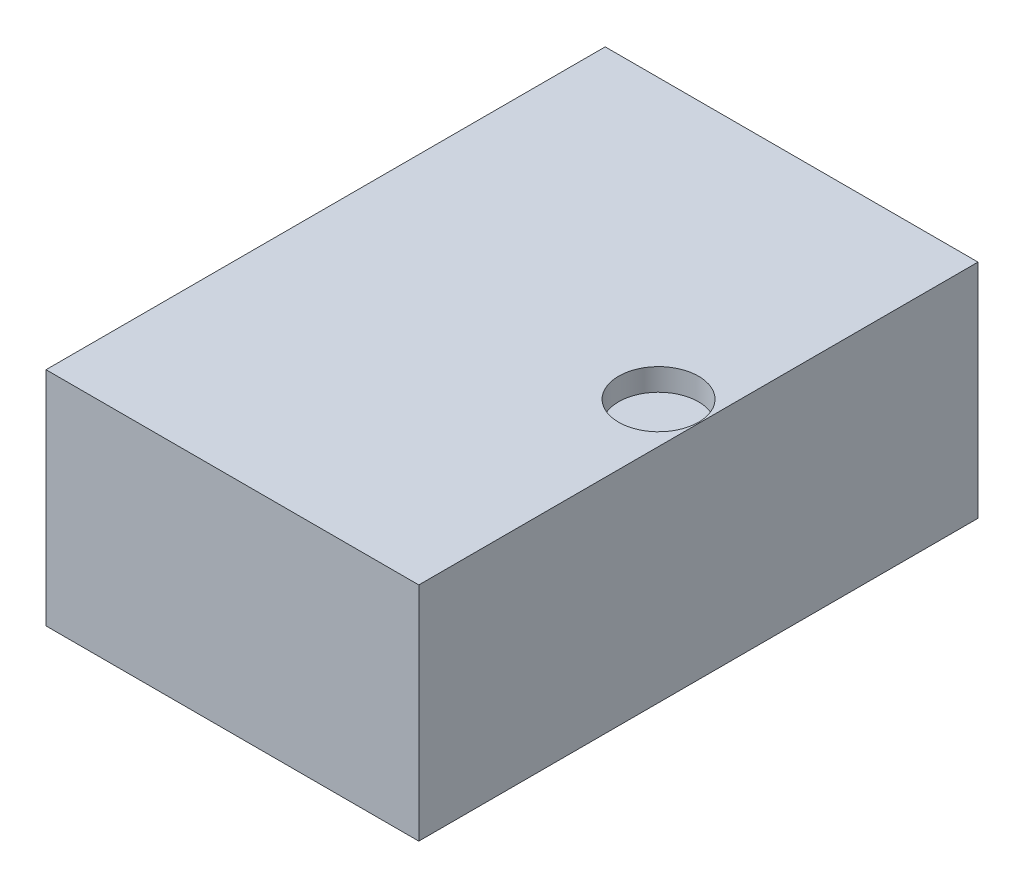
ISO-10303-21;
HEADER;
FILE_DESCRIPTION(('STEP AP214'),'2;1');
FILE_NAME('part.step','',(''),(''),'','','');
FILE_SCHEMA(('AUTOMOTIVE_DESIGN { 1 0 10303 214 1 1 1 1 }'));
ENDSEC;
DATA;
#1=APPLICATION_CONTEXT('core data for automotive mechanical design processes');
#2=APPLICATION_PROTOCOL_DEFINITION('international standard','automotive_design',2000,#1);
#3=PRODUCT_CONTEXT('',#1,'mechanical');
#4=PRODUCT('Part','Part','',(#3));
#5=PRODUCT_RELATED_PRODUCT_CATEGORY('part','',(#4));
#6=PRODUCT_DEFINITION_FORMATION('','',#4);
#7=PRODUCT_DEFINITION_CONTEXT('part definition',#1,'design');
#8=PRODUCT_DEFINITION('design','',#6,#7);
#9=PRODUCT_DEFINITION_SHAPE('','',#8);
#10=(LENGTH_UNIT() NAMED_UNIT(*) SI_UNIT(.MILLI.,.METRE.));
#11=(NAMED_UNIT(*) PLANE_ANGLE_UNIT() SI_UNIT($,.RADIAN.));
#12=(NAMED_UNIT(*) SI_UNIT($,.STERADIAN.) SOLID_ANGLE_UNIT());
#13=UNCERTAINTY_MEASURE_WITH_UNIT(LENGTH_MEASURE(1.E-05),#10,'distance_accuracy_value','');
#14=(GEOMETRIC_REPRESENTATION_CONTEXT(3) GLOBAL_UNCERTAINTY_ASSIGNED_CONTEXT((#13)) GLOBAL_UNIT_ASSIGNED_CONTEXT((#10,
#11,#12)) REPRESENTATION_CONTEXT('',''));
#15=CARTESIAN_POINT('',(0.,0.,0.));
#16=DIRECTION('',(0.,0.,1.));
#17=DIRECTION('',(1.,0.,0.));
#18=AXIS2_PLACEMENT_3D('',#15,#16,#17);
#19=CARTESIAN_POINT('',(0.,0.635,0.));
#20=DIRECTION('',(1.,0.,0.));
#21=DIRECTION('',(0.,0.,-1.));
#22=AXIS2_PLACEMENT_3D('',#19,#20,#21);
#23=PLANE('',#22);
#24=DIRECTION('',(0.,0.,1.));
#25=VECTOR('',#24,1.);
#26=CARTESIAN_POINT('',(0.,0.,0.));
#27=LINE('',#26,#25);
#28=CARTESIAN_POINT('',(0.,0.,-1.6002));
#29=VERTEX_POINT('',#28);
#30=CARTESIAN_POINT('',(0.,0.,0.));
#31=VERTEX_POINT('',#30);
#32=EDGE_CURVE('E95',#29,#31,#27,.T.);
#33=ORIENTED_EDGE('',*,*,#32,.T.);
#34=DIRECTION('',(0.,-1.,0.));
#35=VECTOR('',#34,1.);
#36=CARTESIAN_POINT('',(0.,0.635,0.));
#37=LINE('',#36,#35);
#38=CARTESIAN_POINT('',(0.,0.635,0.));
#39=VERTEX_POINT('',#38);
#40=EDGE_CURVE('E11',#39,#31,#37,.T.);
#41=ORIENTED_EDGE('',*,*,#40,.F.);
#42=DIRECTION('',(0.,0.,1.));
#43=VECTOR('',#42,1.);
#44=CARTESIAN_POINT('',(0.,0.635,0.));
#45=LINE('',#44,#43);
#46=CARTESIAN_POINT('',(0.,0.635,-1.6002));
#47=VERTEX_POINT('',#46);
#48=EDGE_CURVE('E83',#47,#39,#45,.T.);
#49=ORIENTED_EDGE('',*,*,#48,.F.);
#50=DIRECTION('',(0.,-1.,0.));
#51=VECTOR('',#50,1.);
#52=CARTESIAN_POINT('',(0.,0.635,-1.6002));
#53=LINE('',#52,#51);
#54=EDGE_CURVE('E91',#47,#29,#53,.T.);
#55=ORIENTED_EDGE('',*,*,#54,.T.);
#56=EDGE_LOOP('',(#33,#41,#49,#55));
#57=FACE_BOUND('',#56,.T.);
#58=ADVANCED_FACE('F32',(#57),#23,.F.);
#59=CARTESIAN_POINT('',(0.,0.635,0.));
#60=DIRECTION('',(0.,0.,-1.));
#61=DIRECTION('',(-1.,0.,0.));
#62=AXIS2_PLACEMENT_3D('',#59,#60,#61);
#63=PLANE('',#62);
#64=DIRECTION('',(1.,0.,0.));
#65=VECTOR('',#64,1.);
#66=CARTESIAN_POINT('',(0.,0.,0.));
#67=LINE('',#66,#65);
#68=CARTESIAN_POINT('',(1.0668,0.,0.));
#69=VERTEX_POINT('',#68);
#70=EDGE_CURVE('E87',#31,#69,#67,.T.);
#71=ORIENTED_EDGE('',*,*,#70,.T.);
#72=DIRECTION('',(0.,-1.,0.));
#73=VECTOR('',#72,1.);
#74=CARTESIAN_POINT('',(1.0668,0.635,0.));
#75=LINE('',#74,#73);
#76=CARTESIAN_POINT('',(1.0668,0.635,0.));
#77=VERTEX_POINT('',#76);
#78=EDGE_CURVE('E40',#77,#69,#75,.T.);
#79=ORIENTED_EDGE('',*,*,#78,.F.);
#80=DIRECTION('',(1.,0.,0.));
#81=VECTOR('',#80,1.);
#82=CARTESIAN_POINT('',(0.,0.635,0.));
#83=LINE('',#82,#81);
#84=EDGE_CURVE('E78',#39,#77,#83,.T.);
#85=ORIENTED_EDGE('',*,*,#84,.F.);
#86=ORIENTED_EDGE('',*,*,#40,.T.);
#87=EDGE_LOOP('',(#71,#79,#85,#86));
#88=FACE_BOUND('',#87,.T.);
#89=ADVANCED_FACE('F86',(#88),#63,.F.);
#90=CARTESIAN_POINT('',(1.0668,0.635,0.));
#91=DIRECTION('',(-1.,0.,0.));
#92=DIRECTION('',(0.,0.,1.));
#93=AXIS2_PLACEMENT_3D('',#90,#91,#92);
#94=PLANE('',#93);
#95=DIRECTION('',(0.,0.,-1.));
#96=VECTOR('',#95,1.);
#97=CARTESIAN_POINT('',(1.0668,0.,0.));
#98=LINE('',#97,#96);
#99=CARTESIAN_POINT('',(1.0668,0.,-1.6002));
#100=VERTEX_POINT('',#99);
#101=EDGE_CURVE('E65',#69,#100,#98,.T.);
#102=ORIENTED_EDGE('',*,*,#101,.T.);
#103=DIRECTION('',(0.,-1.,0.));
#104=VECTOR('',#103,1.);
#105=CARTESIAN_POINT('',(1.0668,0.635,-1.6002));
#106=LINE('',#105,#104);
#107=CARTESIAN_POINT('',(1.0668,0.635,-1.6002));
#108=VERTEX_POINT('',#107);
#109=EDGE_CURVE('E88',#108,#100,#106,.T.);
#110=ORIENTED_EDGE('',*,*,#109,.F.);
#111=DIRECTION('',(0.,0.,-1.));
#112=VECTOR('',#111,1.);
#113=CARTESIAN_POINT('',(1.0668,0.635,0.));
#114=LINE('',#113,#112);
#115=EDGE_CURVE('E81',#77,#108,#114,.T.);
#116=ORIENTED_EDGE('',*,*,#115,.F.);
#117=ORIENTED_EDGE('',*,*,#78,.T.);
#118=EDGE_LOOP('',(#102,#110,#116,#117));
#119=FACE_BOUND('',#118,.T.);
#120=ADVANCED_FACE('F89',(#119),#94,.F.);
#121=CARTESIAN_POINT('',(0.,0.635,-1.6002));
#122=DIRECTION('',(0.,0.,1.));
#123=DIRECTION('',(1.,0.,0.));
#124=AXIS2_PLACEMENT_3D('',#121,#122,#123);
#125=PLANE('',#124);
#126=DIRECTION('',(-1.,0.,0.));
#127=VECTOR('',#126,1.);
#128=CARTESIAN_POINT('',(0.,0.,-1.6002));
#129=LINE('',#128,#127);
#130=EDGE_CURVE('E71',#100,#29,#129,.T.);
#131=ORIENTED_EDGE('',*,*,#130,.T.);
#132=ORIENTED_EDGE('',*,*,#54,.F.);
#133=DIRECTION('',(-1.,0.,0.));
#134=VECTOR('',#133,1.);
#135=CARTESIAN_POINT('',(0.,0.635,-1.6002));
#136=LINE('',#135,#134);
#137=EDGE_CURVE('E48',#108,#47,#136,.T.);
#138=ORIENTED_EDGE('',*,*,#137,.F.);
#139=ORIENTED_EDGE('',*,*,#109,.T.);
#140=EDGE_LOOP('',(#131,#132,#138,#139));
#141=FACE_BOUND('',#140,.T.);
#142=ADVANCED_FACE('F103',(#141),#125,.F.);
#143=CARTESIAN_POINT('',(0.,0.635,-1.6002));
#144=DIRECTION('',(0.,-1.,0.));
#145=DIRECTION('',(0.,0.,-1.));
#146=AXIS2_PLACEMENT_3D('',#143,#144,#145);
#147=PLANE('',#146);
#148=CARTESIAN_POINT('',(0.949567269795992,0.635,-0.803334460646085));
#149=DIRECTION('',(0.,1.,0.));
#150=DIRECTION('',(0.,0.,1.));
#151=AXIS2_PLACEMENT_3D('',#148,#149,#150);
#152=CIRCLE('',#151,0.1143);
#153=CARTESIAN_POINT('',(0.949567269795992,0.635,-0.689034460646085));
#154=VERTEX_POINT('',#153);
#155=EDGE_CURVE('E109',#154,#154,#152,.T.);
#156=ORIENTED_EDGE('',*,*,#155,.F.);
#157=EDGE_LOOP('',(#156));
#158=FACE_BOUND('',#157,.T.);
#159=ORIENTED_EDGE('',*,*,#48,.T.);
#160=ORIENTED_EDGE('',*,*,#84,.T.);
#161=ORIENTED_EDGE('',*,*,#115,.T.);
#162=ORIENTED_EDGE('',*,*,#137,.T.);
#163=EDGE_LOOP('',(#159,#160,#161,#162));
#164=FACE_BOUND('',#163,.T.);
#165=ADVANCED_FACE('F79',(#158,#164),#147,.F.);
#166=CARTESIAN_POINT('',(0.,0.,-1.6002));
#167=DIRECTION('',(0.,-1.,0.));
#168=DIRECTION('',(0.,0.,-1.));
#169=AXIS2_PLACEMENT_3D('',#166,#167,#168);
#170=PLANE('',#169);
#171=ORIENTED_EDGE('',*,*,#32,.F.);
#172=ORIENTED_EDGE('',*,*,#130,.F.);
#173=ORIENTED_EDGE('',*,*,#101,.F.);
#174=ORIENTED_EDGE('',*,*,#70,.F.);
#175=EDGE_LOOP('',(#171,#172,#173,#174));
#176=FACE_BOUND('',#175,.T.);
#177=ADVANCED_FACE('F106',(#176),#170,.T.);
#178=CARTESIAN_POINT('',(0.949567269795992,0.5715,-0.803334460646085));
#179=DIRECTION('',(0.,1.,0.));
#180=DIRECTION('',(0.,0.,1.));
#181=AXIS2_PLACEMENT_3D('',#178,#179,#180);
#182=CYLINDRICAL_SURFACE('',#181,0.1143);
#183=CARTESIAN_POINT('',(0.949567269795992,0.5715,-0.803334460646085));
#184=DIRECTION('',(0.,1.,0.));
#185=DIRECTION('',(0.,0.,1.));
#186=AXIS2_PLACEMENT_3D('',#183,#184,#185);
#187=CIRCLE('',#186,0.1143);
#188=CARTESIAN_POINT('',(0.949567269795992,0.5715,-0.689034460646085));
#189=VERTEX_POINT('',#188);
#190=EDGE_CURVE('E98',#189,#189,#187,.T.);
#191=ORIENTED_EDGE('',*,*,#190,.F.);
#192=EDGE_LOOP('',(#191));
#193=FACE_BOUND('',#192,.T.);
#194=ORIENTED_EDGE('',*,*,#155,.T.);
#195=EDGE_LOOP('',(#194));
#196=FACE_BOUND('',#195,.T.);
#197=ADVANCED_FACE('F117',(#193,#196),#182,.F.);
#198=CARTESIAN_POINT('',(0.949567269795992,0.5715,-0.803334460646085));
#199=DIRECTION('',(0.,1.,0.));
#200=DIRECTION('',(0.,0.,1.));
#201=AXIS2_PLACEMENT_3D('',#198,#199,#200);
#202=PLANE('',#201);
#203=ORIENTED_EDGE('',*,*,#190,.T.);
#204=EDGE_LOOP('',(#203));
#205=FACE_BOUND('',#204,.T.);
#206=ADVANCED_FACE('F115',(#205),#202,.T.);
#207=CLOSED_SHELL('',(#58,#89,#120,#142,#165,#177,#197,#206));
#208=MANIFOLD_SOLID_BREP('B2',#207);
#209=ADVANCED_BREP_SHAPE_REPRESENTATION('',(#18,#208),#14);
#210=SHAPE_DEFINITION_REPRESENTATION(#9,#209);
ENDSEC;
END-ISO-10303-21;
